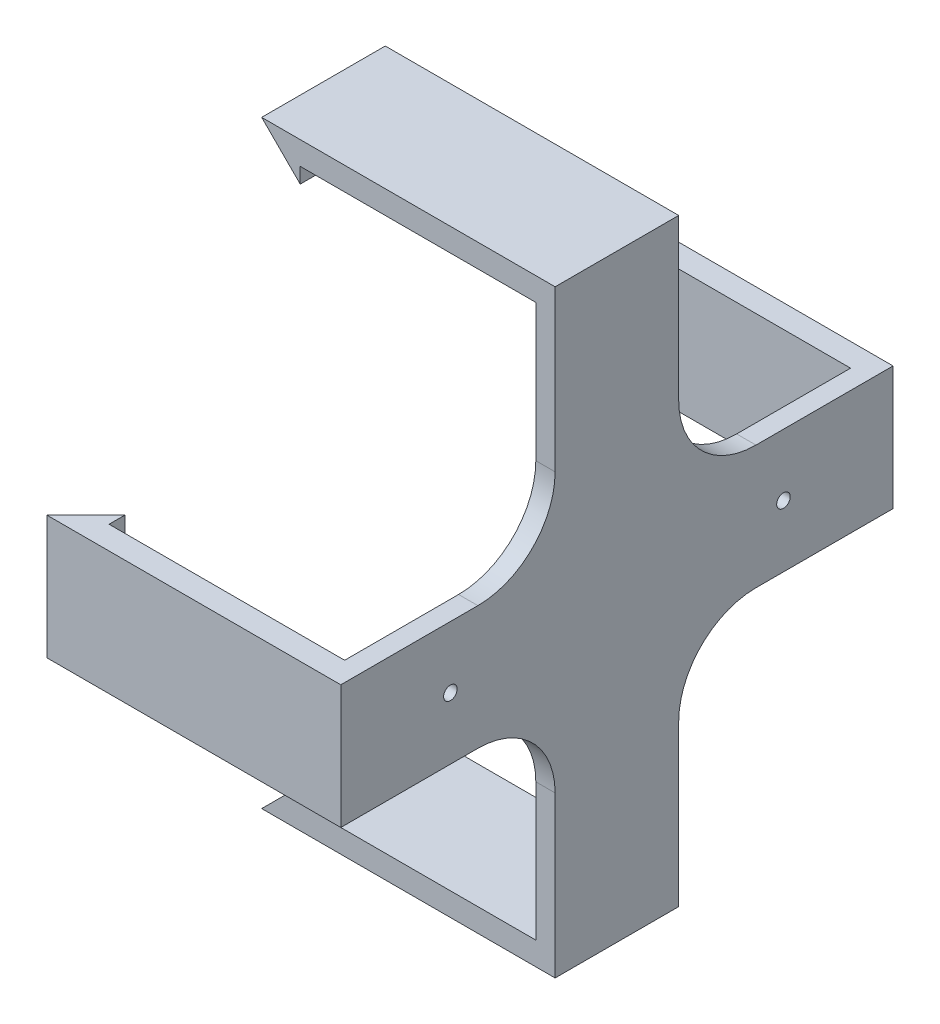
ISO-10303-21;
HEADER;
FILE_DESCRIPTION(('STEP AP214'),'2;1');
FILE_NAME('part.step','',(''),(''),'','','');
FILE_SCHEMA(('AUTOMOTIVE_DESIGN { 1 0 10303 214 1 1 1 1 }'));
ENDSEC;
DATA;
#1=APPLICATION_CONTEXT('core data for automotive mechanical design processes');
#2=APPLICATION_PROTOCOL_DEFINITION('international standard','automotive_design',2000,#1);
#3=PRODUCT_CONTEXT('',#1,'mechanical');
#4=PRODUCT('Part','Part','',(#3));
#5=PRODUCT_RELATED_PRODUCT_CATEGORY('part','',(#4));
#6=PRODUCT_DEFINITION_FORMATION('','',#4);
#7=PRODUCT_DEFINITION_CONTEXT('part definition',#1,'design');
#8=PRODUCT_DEFINITION('design','',#6,#7);
#9=PRODUCT_DEFINITION_SHAPE('','',#8);
#10=(LENGTH_UNIT() NAMED_UNIT(*) SI_UNIT(.MILLI.,.METRE.));
#11=(NAMED_UNIT(*) PLANE_ANGLE_UNIT() SI_UNIT($,.RADIAN.));
#12=(NAMED_UNIT(*) SI_UNIT($,.STERADIAN.) SOLID_ANGLE_UNIT());
#13=UNCERTAINTY_MEASURE_WITH_UNIT(LENGTH_MEASURE(1.E-05),#10,'distance_accuracy_value','');
#14=(GEOMETRIC_REPRESENTATION_CONTEXT(3) GLOBAL_UNCERTAINTY_ASSIGNED_CONTEXT((#13)) GLOBAL_UNIT_ASSIGNED_CONTEXT((#10,
#11,#12)) REPRESENTATION_CONTEXT('',''));
#15=CARTESIAN_POINT('',(0.,0.,0.));
#16=DIRECTION('',(0.,0.,1.));
#17=DIRECTION('',(1.,0.,0.));
#18=AXIS2_PLACEMENT_3D('',#15,#16,#17);
#19=CARTESIAN_POINT('',(6.35,0.,54.7650869624903));
#20=DIRECTION('',(-1.,0.,0.));
#21=DIRECTION('',(0.,0.,1.));
#22=AXIS2_PLACEMENT_3D('',#19,#20,#21);
#23=CYLINDRICAL_SURFACE('',#22,2.2225);
#24=CARTESIAN_POINT('',(6.35,0.,54.7650869624903));
#25=DIRECTION('',(1.,0.,0.));
#26=DIRECTION('',(0.,0.,-1.));
#27=AXIS2_PLACEMENT_3D('',#24,#25,#26);
#28=CIRCLE('',#27,2.2225);
#29=CARTESIAN_POINT('',(6.35,0.,52.5425869624903));
#30=VERTEX_POINT('',#29);
#31=EDGE_CURVE('E386',#30,#30,#28,.F.);
#32=ORIENTED_EDGE('',*,*,#31,.F.);
#33=EDGE_LOOP('',(#32));
#34=FACE_BOUND('',#33,.T.);
#35=CARTESIAN_POINT('',(2.54,0.,54.7650869624903));
#36=DIRECTION('',(-1.,0.,0.));
#37=DIRECTION('',(0.,0.,1.));
#38=AXIS2_PLACEMENT_3D('',#35,#36,#37);
#39=CIRCLE('',#38,2.2225);
#40=CARTESIAN_POINT('',(2.54,0.,56.9875869624903));
#41=VERTEX_POINT('',#40);
#42=EDGE_CURVE('E47',#41,#41,#39,.F.);
#43=ORIENTED_EDGE('',*,*,#42,.F.);
#44=EDGE_LOOP('',(#43));
#45=FACE_BOUND('',#44,.T.);
#46=ADVANCED_FACE('F43',(#34,#45),#23,.F.);
#47=CARTESIAN_POINT('',(0.,0.,0.));
#48=DIRECTION('',(1.,0.,0.));
#49=DIRECTION('',(0.,0.,-1.));
#50=AXIS2_PLACEMENT_3D('',#47,#48,#49);
#51=PLANE('',#50);
#52=CARTESIAN_POINT('',(0.,0.,54.7650869624903));
#53=DIRECTION('',(-1.,0.,0.));
#54=DIRECTION('',(0.,0.,1.));
#55=AXIS2_PLACEMENT_3D('',#52,#53,#54);
#56=CIRCLE('',#55,3.93699999999999);
#57=CARTESIAN_POINT('',(0.,0.,58.7020869624903));
#58=VERTEX_POINT('',#57);
#59=EDGE_CURVE('E457',#58,#58,#56,.T.);
#60=ORIENTED_EDGE('',*,*,#59,.F.);
#61=EDGE_LOOP('',(#60));
#62=FACE_BOUND('',#61,.T.);
#63=CARTESIAN_POINT('',(0.,0.,-54.7650869624903));
#64=DIRECTION('',(-1.,0.,0.));
#65=DIRECTION('',(0.,0.,-1.));
#66=AXIS2_PLACEMENT_3D('',#63,#64,#65);
#67=CIRCLE('',#66,3.93699999999999);
#68=CARTESIAN_POINT('',(0.,0.,-58.7020869624903));
#69=VERTEX_POINT('',#68);
#70=EDGE_CURVE('E462',#69,#69,#67,.T.);
#71=ORIENTED_EDGE('',*,*,#70,.F.);
#72=EDGE_LOOP('',(#71));
#73=FACE_BOUND('',#72,.T.);
#74=DIRECTION('',(0.,0.,-1.));
#75=VECTOR('',#74,1.);
#76=CARTESIAN_POINT('',(0.,-90.805,0.));
#77=LINE('',#76,#75);
#78=CARTESIAN_POINT('',(0.,-90.805,20.32));
#79=VERTEX_POINT('',#78);
#80=CARTESIAN_POINT('',(0.,-90.805,-20.32));
#81=VERTEX_POINT('',#80);
#82=EDGE_CURVE('E309',#79,#81,#77,.T.);
#83=ORIENTED_EDGE('',*,*,#82,.F.);
#84=DIRECTION('',(0.,1.,0.));
#85=VECTOR('',#84,1.);
#86=CARTESIAN_POINT('',(0.,0.,20.32));
#87=LINE('',#86,#85);
#88=CARTESIAN_POINT('',(0.,-45.72,20.32));
#89=VERTEX_POINT('',#88);
#90=EDGE_CURVE('E398',#79,#89,#87,.T.);
#91=ORIENTED_EDGE('',*,*,#90,.T.);
#92=CARTESIAN_POINT('',(0.,-45.72,45.72));
#93=DIRECTION('',(1.,0.,0.));
#94=DIRECTION('',(0.,0.,-1.));
#95=AXIS2_PLACEMENT_3D('',#92,#93,#94);
#96=CIRCLE('',#95,25.4);
#97=CARTESIAN_POINT('',(0.,-20.32,45.72));
#98=VERTEX_POINT('',#97);
#99=EDGE_CURVE('E395',#98,#89,#96,.F.);
#100=ORIENTED_EDGE('',*,*,#99,.F.);
#101=DIRECTION('',(0.,0.,1.));
#102=VECTOR('',#101,1.);
#103=CARTESIAN_POINT('',(0.,-20.32,0.));
#104=LINE('',#103,#102);
#105=CARTESIAN_POINT('',(0.,-20.32,83.185));
#106=VERTEX_POINT('',#105);
#107=EDGE_CURVE('E346',#98,#106,#104,.T.);
#108=ORIENTED_EDGE('',*,*,#107,.T.);
#109=DIRECTION('',(0.,-1.,0.));
#110=VECTOR('',#109,1.);
#111=CARTESIAN_POINT('',(0.,0.,83.185));
#112=LINE('',#111,#110);
#113=CARTESIAN_POINT('',(0.,20.32,83.185));
#114=VERTEX_POINT('',#113);
#115=EDGE_CURVE('E319',#114,#106,#112,.T.);
#116=ORIENTED_EDGE('',*,*,#115,.F.);
#117=DIRECTION('',(0.,0.,1.));
#118=VECTOR('',#117,1.);
#119=CARTESIAN_POINT('',(0.,20.32,0.));
#120=LINE('',#119,#118);
#121=CARTESIAN_POINT('',(0.,20.32,45.72));
#122=VERTEX_POINT('',#121);
#123=EDGE_CURVE('E350',#122,#114,#120,.T.);
#124=ORIENTED_EDGE('',*,*,#123,.F.);
#125=CARTESIAN_POINT('',(0.,45.72,45.72));
#126=DIRECTION('',(1.,0.,0.));
#127=DIRECTION('',(0.,0.,-1.));
#128=AXIS2_PLACEMENT_3D('',#125,#126,#127);
#129=CIRCLE('',#128,25.4);
#130=CARTESIAN_POINT('',(0.,45.72,20.32));
#131=VERTEX_POINT('',#130);
#132=EDGE_CURVE('E418',#122,#131,#129,.T.);
#133=ORIENTED_EDGE('',*,*,#132,.T.);
#134=DIRECTION('',(0.,-1.,0.));
#135=VECTOR('',#134,1.);
#136=CARTESIAN_POINT('',(0.,0.,20.32));
#137=LINE('',#136,#135);
#138=CARTESIAN_POINT('',(0.,90.805,20.32));
#139=VERTEX_POINT('',#138);
#140=EDGE_CURVE('E416',#139,#131,#137,.T.);
#141=ORIENTED_EDGE('',*,*,#140,.F.);
#142=DIRECTION('',(0.,0.,1.));
#143=VECTOR('',#142,1.);
#144=CARTESIAN_POINT('',(0.,90.805,0.));
#145=LINE('',#144,#143);
#146=CARTESIAN_POINT('',(0.,90.805,-20.32));
#147=VERTEX_POINT('',#146);
#148=EDGE_CURVE('E329',#147,#139,#145,.T.);
#149=ORIENTED_EDGE('',*,*,#148,.F.);
#150=DIRECTION('',(0.,-1.,0.));
#151=VECTOR('',#150,1.);
#152=CARTESIAN_POINT('',(0.,0.,-20.32));
#153=LINE('',#152,#151);
#154=CARTESIAN_POINT('',(0.,45.72,-20.32));
#155=VERTEX_POINT('',#154);
#156=EDGE_CURVE('E414',#147,#155,#153,.T.);
#157=ORIENTED_EDGE('',*,*,#156,.T.);
#158=CARTESIAN_POINT('',(0.,45.72,-45.72));
#159=DIRECTION('',(1.,0.,0.));
#160=DIRECTION('',(0.,0.,-1.));
#161=AXIS2_PLACEMENT_3D('',#158,#159,#160);
#162=CIRCLE('',#161,25.4);
#163=CARTESIAN_POINT('',(0.,20.32,-45.72));
#164=VERTEX_POINT('',#163);
#165=EDGE_CURVE('E411',#164,#155,#162,.F.);
#166=ORIENTED_EDGE('',*,*,#165,.F.);
#167=DIRECTION('',(0.,0.,-1.));
#168=VECTOR('',#167,1.);
#169=CARTESIAN_POINT('',(0.,20.32,0.));
#170=LINE('',#169,#168);
#171=CARTESIAN_POINT('',(0.,20.32,-83.185));
#172=VERTEX_POINT('',#171);
#173=EDGE_CURVE('E408',#164,#172,#170,.T.);
#174=ORIENTED_EDGE('',*,*,#173,.T.);
#175=DIRECTION('',(0.,-1.,0.));
#176=VECTOR('',#175,1.);
#177=CARTESIAN_POINT('',(0.,0.,-83.185));
#178=LINE('',#177,#176);
#179=CARTESIAN_POINT('',(0.,-20.32,-83.185));
#180=VERTEX_POINT('',#179);
#181=EDGE_CURVE('E339',#172,#180,#178,.T.);
#182=ORIENTED_EDGE('',*,*,#181,.T.);
#183=DIRECTION('',(0.,0.,-1.));
#184=VECTOR('',#183,1.);
#185=CARTESIAN_POINT('',(0.,-20.32,0.));
#186=LINE('',#185,#184);
#187=CARTESIAN_POINT('',(0.,-20.32,-45.72));
#188=VERTEX_POINT('',#187);
#189=EDGE_CURVE('E405',#188,#180,#186,.T.);
#190=ORIENTED_EDGE('',*,*,#189,.F.);
#191=CARTESIAN_POINT('',(0.,-45.72,-45.72));
#192=DIRECTION('',(1.,0.,0.));
#193=DIRECTION('',(0.,0.,-1.));
#194=AXIS2_PLACEMENT_3D('',#191,#192,#193);
#195=CIRCLE('',#194,25.4);
#196=CARTESIAN_POINT('',(0.,-45.72,-20.32));
#197=VERTEX_POINT('',#196);
#198=EDGE_CURVE('E402',#188,#197,#195,.T.);
#199=ORIENTED_EDGE('',*,*,#198,.T.);
#200=DIRECTION('',(0.,1.,0.));
#201=VECTOR('',#200,1.);
#202=CARTESIAN_POINT('',(0.,0.,-20.32));
#203=LINE('',#202,#201);
#204=EDGE_CURVE('E400',#81,#197,#203,.T.);
#205=ORIENTED_EDGE('',*,*,#204,.F.);
#206=EDGE_LOOP('',(#83,#91,#100,#108,#116,#124,#133,#141,#149,#157,#166,#174,#182,#190,#199,#205));
#207=FACE_BOUND('',#206,.T.);
#208=ADVANCED_FACE('F481',(#62,#73,#207),#51,.F.);
#209=CARTESIAN_POINT('',(6.35,0.,90.805));
#210=DIRECTION('',(0.,0.,-1.));
#211=DIRECTION('',(-1.,0.,0.));
#212=AXIS2_PLACEMENT_3D('',#209,#210,#211);
#213=PLANE('',#212);
#214=DIRECTION('',(-1.,0.,0.));
#215=VECTOR('',#214,1.);
#216=CARTESIAN_POINT('',(6.35,20.32,90.805));
#217=LINE('',#216,#215);
#218=CARTESIAN_POINT('',(6.35,20.32,90.805));
#219=VERTEX_POINT('',#218);
#220=CARTESIAN_POINT('',(-90.2733018975171,20.32,90.805));
#221=VERTEX_POINT('',#220);
#222=EDGE_CURVE('E392',#219,#221,#217,.T.);
#223=ORIENTED_EDGE('',*,*,#222,.T.);
#224=DIRECTION('',(0.,-1.,0.));
#225=VECTOR('',#224,1.);
#226=CARTESIAN_POINT('',(-90.2733018975171,20.32,90.805));
#227=LINE('',#226,#225);
#228=CARTESIAN_POINT('',(-90.2733018975171,-20.32,90.805));
#229=VERTEX_POINT('',#228);
#230=EDGE_CURVE('E279',#221,#229,#227,.T.);
#231=ORIENTED_EDGE('',*,*,#230,.T.);
#232=DIRECTION('',(-1.,0.,0.));
#233=VECTOR('',#232,1.);
#234=CARTESIAN_POINT('',(6.35,-20.32,90.805));
#235=LINE('',#234,#233);
#236=CARTESIAN_POINT('',(6.35,-20.32,90.805));
#237=VERTEX_POINT('',#236);
#238=EDGE_CURVE('E11',#237,#229,#235,.T.);
#239=ORIENTED_EDGE('',*,*,#238,.F.);
#240=DIRECTION('',(0.,-1.,0.));
#241=VECTOR('',#240,1.);
#242=CARTESIAN_POINT('',(6.35,0.,90.805));
#243=LINE('',#242,#241);
#244=EDGE_CURVE('E347',#219,#237,#243,.T.);
#245=ORIENTED_EDGE('',*,*,#244,.F.);
#246=EDGE_LOOP('',(#223,#231,#239,#245));
#247=FACE_BOUND('',#246,.T.);
#248=ADVANCED_FACE('F45',(#247),#213,.F.);
#249=CARTESIAN_POINT('',(6.35,-20.32,0.));
#250=DIRECTION('',(0.,-1.,0.));
#251=DIRECTION('',(0.,0.,-1.));
#252=AXIS2_PLACEMENT_3D('',#249,#250,#251);
#253=PLANE('',#252);
#254=ORIENTED_EDGE('',*,*,#107,.F.);
#255=DIRECTION('',(-1.,0.,0.));
#256=VECTOR('',#255,1.);
#257=CARTESIAN_POINT('',(6.35,-20.32,45.72));
#258=LINE('',#257,#256);
#259=CARTESIAN_POINT('',(6.35,-20.32,45.72));
#260=VERTEX_POINT('',#259);
#261=EDGE_CURVE('E52',#260,#98,#258,.T.);
#262=ORIENTED_EDGE('',*,*,#261,.F.);
#263=DIRECTION('',(0.,0.,1.));
#264=VECTOR('',#263,1.);
#265=CARTESIAN_POINT('',(6.35,-20.32,0.));
#266=LINE('',#265,#264);
#267=EDGE_CURVE('E349',#260,#237,#266,.T.);
#268=ORIENTED_EDGE('',*,*,#267,.T.);
#269=ORIENTED_EDGE('',*,*,#238,.T.);
#270=DIRECTION('',(0.707106781186541,0.,-0.707106781186554));
#271=VECTOR('',#270,1.);
#272=CARTESIAN_POINT('',(-90.2733018975171,-20.32,90.805));
#273=LINE('',#272,#271);
#274=CARTESIAN_POINT('',(-77.4699999999999,-20.32,78.0016981024825));
#275=VERTEX_POINT('',#274);
#276=EDGE_CURVE('E287',#229,#275,#273,.T.);
#277=ORIENTED_EDGE('',*,*,#276,.T.);
#278=DIRECTION('',(0.,0.,1.));
#279=VECTOR('',#278,1.);
#280=CARTESIAN_POINT('',(-77.4699999999999,-20.32,78.0016981024825));
#281=LINE('',#280,#279);
#282=CARTESIAN_POINT('',(-77.4699999999999,-20.32,83.185));
#283=VERTEX_POINT('',#282);
#284=EDGE_CURVE('E284',#275,#283,#281,.T.);
#285=ORIENTED_EDGE('',*,*,#284,.T.);
#286=DIRECTION('',(1.,0.,0.));
#287=VECTOR('',#286,1.);
#288=CARTESIAN_POINT('',(-77.47,-20.32,83.185));
#289=LINE('',#288,#287);
#290=EDGE_CURVE('E323',#283,#106,#289,.T.);
#291=ORIENTED_EDGE('',*,*,#290,.T.);
#292=EDGE_LOOP('',(#254,#262,#268,#269,#277,#285,#291));
#293=FACE_BOUND('',#292,.T.);
#294=ADVANCED_FACE('F503',(#293),#253,.T.);
#295=CARTESIAN_POINT('',(6.35,-45.72,45.72));
#296=DIRECTION('',(-1.,0.,0.));
#297=DIRECTION('',(0.,0.,1.));
#298=AXIS2_PLACEMENT_3D('',#295,#296,#297);
#299=CYLINDRICAL_SURFACE('',#298,25.4);
#300=ORIENTED_EDGE('',*,*,#99,.T.);
#301=DIRECTION('',(-1.,0.,0.));
#302=VECTOR('',#301,1.);
#303=CARTESIAN_POINT('',(6.35,-45.72,20.32));
#304=LINE('',#303,#302);
#305=CARTESIAN_POINT('',(6.35,-45.72,20.32));
#306=VERTEX_POINT('',#305);
#307=EDGE_CURVE('E447',#306,#89,#304,.T.);
#308=ORIENTED_EDGE('',*,*,#307,.F.);
#309=CARTESIAN_POINT('',(6.35,-45.72,45.72));
#310=DIRECTION('',(1.,0.,0.));
#311=DIRECTION('',(0.,0.,-1.));
#312=AXIS2_PLACEMENT_3D('',#309,#310,#311);
#313=CIRCLE('',#312,25.4);
#314=EDGE_CURVE('E353',#260,#306,#313,.F.);
#315=ORIENTED_EDGE('',*,*,#314,.F.);
#316=ORIENTED_EDGE('',*,*,#261,.T.);
#317=EDGE_LOOP('',(#300,#308,#315,#316));
#318=FACE_BOUND('',#317,.T.);
#319=ADVANCED_FACE('F499',(#318),#299,.F.);
#320=CARTESIAN_POINT('',(6.35,0.,20.32));
#321=DIRECTION('',(0.,0.,1.));
#322=DIRECTION('',(0.,-1.,0.));
#323=AXIS2_PLACEMENT_3D('',#320,#321,#322);
#324=PLANE('',#323);
#325=ORIENTED_EDGE('',*,*,#90,.F.);
#326=DIRECTION('',(1.,0.,0.));
#327=VECTOR('',#326,1.);
#328=CARTESIAN_POINT('',(-77.47,-90.805,20.32));
#329=LINE('',#328,#327);
#330=CARTESIAN_POINT('',(-77.47,-90.805,20.32));
#331=VERTEX_POINT('',#330);
#332=EDGE_CURVE('E317',#331,#79,#329,.T.);
#333=ORIENTED_EDGE('',*,*,#332,.F.);
#334=DIRECTION('',(0.,-1.,0.));
#335=VECTOR('',#334,1.);
#336=CARTESIAN_POINT('',(-77.47,-85.7466948068078,20.32));
#337=LINE('',#336,#335);
#338=CARTESIAN_POINT('',(-77.47,-85.7466948068078,20.32));
#339=VERTEX_POINT('',#338);
#340=EDGE_CURVE('E261',#339,#331,#337,.T.);
#341=ORIENTED_EDGE('',*,*,#340,.F.);
#342=DIRECTION('',(0.707106781186551,0.707106781186544,0.));
#343=VECTOR('',#342,1.);
#344=CARTESIAN_POINT('',(-90.1483051931923,-98.425,20.32));
#345=LINE('',#344,#343);
#346=CARTESIAN_POINT('',(-90.1483051931923,-98.425,20.32));
#347=VERTEX_POINT('',#346);
#348=EDGE_CURVE('E258',#347,#339,#345,.T.);
#349=ORIENTED_EDGE('',*,*,#348,.F.);
#350=DIRECTION('',(-1.,0.,0.));
#351=VECTOR('',#350,1.);
#352=CARTESIAN_POINT('',(6.35,-98.425,20.32));
#353=LINE('',#352,#351);
#354=CARTESIAN_POINT('',(6.35,-98.425,20.32));
#355=VERTEX_POINT('',#354);
#356=EDGE_CURVE('E240',#355,#347,#353,.T.);
#357=ORIENTED_EDGE('',*,*,#356,.F.);
#358=DIRECTION('',(0.,1.,0.));
#359=VECTOR('',#358,1.);
#360=CARTESIAN_POINT('',(6.35,0.,20.32));
#361=LINE('',#360,#359);
#362=EDGE_CURVE('E355',#355,#306,#361,.T.);
#363=ORIENTED_EDGE('',*,*,#362,.T.);
#364=ORIENTED_EDGE('',*,*,#307,.T.);
#365=EDGE_LOOP('',(#325,#333,#341,#349,#357,#363,#364));
#366=FACE_BOUND('',#365,.T.);
#367=ADVANCED_FACE('F493',(#366),#324,.T.);
#368=CARTESIAN_POINT('',(6.35,-98.425,0.));
#369=DIRECTION('',(0.,-1.,0.));
#370=DIRECTION('',(0.,0.,-1.));
#371=AXIS2_PLACEMENT_3D('',#368,#369,#370);
#372=PLANE('',#371);
#373=ORIENTED_EDGE('',*,*,#356,.T.);
#374=DIRECTION('',(0.,0.,-1.));
#375=VECTOR('',#374,1.);
#376=CARTESIAN_POINT('',(-90.1483051931923,-98.425,20.32));
#377=LINE('',#376,#375);
#378=CARTESIAN_POINT('',(-90.1483051931923,-98.425,-20.32));
#379=VERTEX_POINT('',#378);
#380=EDGE_CURVE('E244',#347,#379,#377,.T.);
#381=ORIENTED_EDGE('',*,*,#380,.T.);
#382=DIRECTION('',(-1.,0.,0.));
#383=VECTOR('',#382,1.);
#384=CARTESIAN_POINT('',(6.35,-98.425,-20.32));
#385=LINE('',#384,#383);
#386=CARTESIAN_POINT('',(6.35,-98.425,-20.32));
#387=VERTEX_POINT('',#386);
#388=EDGE_CURVE('E230',#387,#379,#385,.T.);
#389=ORIENTED_EDGE('',*,*,#388,.F.);
#390=DIRECTION('',(0.,0.,1.));
#391=VECTOR('',#390,1.);
#392=CARTESIAN_POINT('',(6.35,-98.425,0.));
#393=LINE('',#392,#391);
#394=EDGE_CURVE('E358',#387,#355,#393,.T.);
#395=ORIENTED_EDGE('',*,*,#394,.T.);
#396=EDGE_LOOP('',(#373,#381,#389,#395));
#397=FACE_BOUND('',#396,.T.);
#398=ADVANCED_FACE('F245',(#397),#372,.T.);
#399=CARTESIAN_POINT('',(6.35,0.,-20.32));
#400=DIRECTION('',(0.,0.,1.));
#401=DIRECTION('',(0.,-1.,0.));
#402=AXIS2_PLACEMENT_3D('',#399,#400,#401);
#403=PLANE('',#402);
#404=ORIENTED_EDGE('',*,*,#388,.T.);
#405=DIRECTION('',(0.707106781186551,0.707106781186544,0.));
#406=VECTOR('',#405,1.);
#407=CARTESIAN_POINT('',(-90.1483051931923,-98.425,-20.32));
#408=LINE('',#407,#406);
#409=CARTESIAN_POINT('',(-77.47,-85.7466948068078,-20.32));
#410=VERTEX_POINT('',#409);
#411=EDGE_CURVE('E234',#379,#410,#408,.T.);
#412=ORIENTED_EDGE('',*,*,#411,.T.);
#413=DIRECTION('',(0.,-1.,0.));
#414=VECTOR('',#413,1.);
#415=CARTESIAN_POINT('',(-77.47,-85.7466948068078,-20.32));
#416=LINE('',#415,#414);
#417=CARTESIAN_POINT('',(-77.47,-90.805,-20.32));
#418=VERTEX_POINT('',#417);
#419=EDGE_CURVE('E254',#410,#418,#416,.T.);
#420=ORIENTED_EDGE('',*,*,#419,.T.);
#421=DIRECTION('',(1.,0.,0.));
#422=VECTOR('',#421,1.);
#423=CARTESIAN_POINT('',(-77.47,-90.805,-20.32));
#424=LINE('',#423,#422);
#425=EDGE_CURVE('E60',#418,#81,#424,.T.);
#426=ORIENTED_EDGE('',*,*,#425,.T.);
#427=ORIENTED_EDGE('',*,*,#204,.T.);
#428=DIRECTION('',(-1.,0.,0.));
#429=VECTOR('',#428,1.);
#430=CARTESIAN_POINT('',(6.35,-45.72,-20.32));
#431=LINE('',#430,#429);
#432=CARTESIAN_POINT('',(6.35,-45.72,-20.32));
#433=VERTEX_POINT('',#432);
#434=EDGE_CURVE('E241',#433,#197,#431,.T.);
#435=ORIENTED_EDGE('',*,*,#434,.F.);
#436=DIRECTION('',(0.,1.,0.));
#437=VECTOR('',#436,1.);
#438=CARTESIAN_POINT('',(6.35,0.,-20.32));
#439=LINE('',#438,#437);
#440=EDGE_CURVE('E236',#387,#433,#439,.T.);
#441=ORIENTED_EDGE('',*,*,#440,.F.);
#442=EDGE_LOOP('',(#404,#412,#420,#426,#427,#435,#441));
#443=FACE_BOUND('',#442,.T.);
#444=ADVANCED_FACE('F232',(#443),#403,.F.);
#445=CARTESIAN_POINT('',(6.35,-45.72,-45.72));
#446=DIRECTION('',(-1.,0.,0.));
#447=DIRECTION('',(0.,0.,1.));
#448=AXIS2_PLACEMENT_3D('',#445,#446,#447);
#449=CYLINDRICAL_SURFACE('',#448,25.4);
#450=ORIENTED_EDGE('',*,*,#198,.F.);
#451=DIRECTION('',(-1.,0.,0.));
#452=VECTOR('',#451,1.);
#453=CARTESIAN_POINT('',(6.35,-20.32,-45.72));
#454=LINE('',#453,#452);
#455=CARTESIAN_POINT('',(6.35,-20.32,-45.72));
#456=VERTEX_POINT('',#455);
#457=EDGE_CURVE('E442',#456,#188,#454,.T.);
#458=ORIENTED_EDGE('',*,*,#457,.F.);
#459=CARTESIAN_POINT('',(6.35,-45.72,-45.72));
#460=DIRECTION('',(1.,0.,0.));
#461=DIRECTION('',(0.,0.,-1.));
#462=AXIS2_PLACEMENT_3D('',#459,#460,#461);
#463=CIRCLE('',#462,25.4);
#464=EDGE_CURVE('E361',#456,#433,#463,.T.);
#465=ORIENTED_EDGE('',*,*,#464,.T.);
#466=ORIENTED_EDGE('',*,*,#434,.T.);
#467=EDGE_LOOP('',(#450,#458,#465,#466));
#468=FACE_BOUND('',#467,.T.);
#469=ADVANCED_FACE('F554',(#468),#449,.F.);
#470=CARTESIAN_POINT('',(6.35,-20.32,0.));
#471=DIRECTION('',(0.,1.,0.));
#472=DIRECTION('',(0.,0.,1.));
#473=AXIS2_PLACEMENT_3D('',#470,#471,#472);
#474=PLANE('',#473);
#475=ORIENTED_EDGE('',*,*,#189,.T.);
#476=DIRECTION('',(1.,0.,0.));
#477=VECTOR('',#476,1.);
#478=CARTESIAN_POINT('',(-77.47,-20.32,-83.185));
#479=LINE('',#478,#477);
#480=CARTESIAN_POINT('',(-77.47,-20.32,-83.185));
#481=VERTEX_POINT('',#480);
#482=EDGE_CURVE('E68',#481,#180,#479,.T.);
#483=ORIENTED_EDGE('',*,*,#482,.F.);
#484=DIRECTION('',(0.,0.,1.));
#485=VECTOR('',#484,1.);
#486=CARTESIAN_POINT('',(-77.47,-20.32,-78.0016981024825));
#487=LINE('',#486,#485);
#488=CARTESIAN_POINT('',(-77.47,-20.32,-78.0016981024825));
#489=VERTEX_POINT('',#488);
#490=EDGE_CURVE('E291',#481,#489,#487,.T.);
#491=ORIENTED_EDGE('',*,*,#490,.T.);
#492=DIRECTION('',(-0.707106781186541,0.,-0.707106781186554));
#493=VECTOR('',#492,1.);
#494=CARTESIAN_POINT('',(-90.2733018975173,-20.32,-90.805));
#495=LINE('',#494,#493);
#496=CARTESIAN_POINT('',(-90.2733018975173,-20.32,-90.805));
#497=VERTEX_POINT('',#496);
#498=EDGE_CURVE('E299',#489,#497,#495,.T.);
#499=ORIENTED_EDGE('',*,*,#498,.T.);
#500=DIRECTION('',(-1.,0.,0.));
#501=VECTOR('',#500,1.);
#502=CARTESIAN_POINT('',(6.35,-20.32,-90.805));
#503=LINE('',#502,#501);
#504=CARTESIAN_POINT('',(6.35,-20.32,-90.805));
#505=VERTEX_POINT('',#504);
#506=EDGE_CURVE('E440',#505,#497,#503,.T.);
#507=ORIENTED_EDGE('',*,*,#506,.F.);
#508=DIRECTION('',(0.,0.,-1.));
#509=VECTOR('',#508,1.);
#510=CARTESIAN_POINT('',(6.35,-20.32,0.));
#511=LINE('',#510,#509);
#512=EDGE_CURVE('E364',#456,#505,#511,.T.);
#513=ORIENTED_EDGE('',*,*,#512,.F.);
#514=ORIENTED_EDGE('',*,*,#457,.T.);
#515=EDGE_LOOP('',(#475,#483,#491,#499,#507,#513,#514));
#516=FACE_BOUND('',#515,.T.);
#517=ADVANCED_FACE('F549',(#516),#474,.F.);
#518=CARTESIAN_POINT('',(6.35,0.,-90.805));
#519=DIRECTION('',(0.,0.,-1.));
#520=DIRECTION('',(-1.,0.,0.));
#521=AXIS2_PLACEMENT_3D('',#518,#519,#520);
#522=PLANE('',#521);
#523=ORIENTED_EDGE('',*,*,#506,.T.);
#524=DIRECTION('',(0.,-1.,0.));
#525=VECTOR('',#524,1.);
#526=CARTESIAN_POINT('',(-90.2733018975173,20.32,-90.805));
#527=LINE('',#526,#525);
#528=CARTESIAN_POINT('',(-90.2733018975173,20.32,-90.805));
#529=VERTEX_POINT('',#528);
#530=EDGE_CURVE('E306',#529,#497,#527,.T.);
#531=ORIENTED_EDGE('',*,*,#530,.F.);
#532=DIRECTION('',(-1.,0.,0.));
#533=VECTOR('',#532,1.);
#534=CARTESIAN_POINT('',(6.35,20.32,-90.805));
#535=LINE('',#534,#533);
#536=CARTESIAN_POINT('',(6.35,20.32,-90.805));
#537=VERTEX_POINT('',#536);
#538=EDGE_CURVE('E438',#537,#529,#535,.T.);
#539=ORIENTED_EDGE('',*,*,#538,.F.);
#540=DIRECTION('',(0.,-1.,0.));
#541=VECTOR('',#540,1.);
#542=CARTESIAN_POINT('',(6.35,0.,-90.805));
#543=LINE('',#542,#541);
#544=EDGE_CURVE('E366',#537,#505,#543,.T.);
#545=ORIENTED_EDGE('',*,*,#544,.T.);
#546=EDGE_LOOP('',(#523,#531,#539,#545));
#547=FACE_BOUND('',#546,.T.);
#548=ADVANCED_FACE('F606',(#547),#522,.T.);
#549=CARTESIAN_POINT('',(6.35,20.32,0.));
#550=DIRECTION('',(0.,1.,0.));
#551=DIRECTION('',(0.,0.,1.));
#552=AXIS2_PLACEMENT_3D('',#549,#550,#551);
#553=PLANE('',#552);
#554=ORIENTED_EDGE('',*,*,#173,.F.);
#555=DIRECTION('',(-1.,0.,0.));
#556=VECTOR('',#555,1.);
#557=CARTESIAN_POINT('',(6.35,20.32,-45.72));
#558=LINE('',#557,#556);
#559=CARTESIAN_POINT('',(6.35,20.32,-45.72));
#560=VERTEX_POINT('',#559);
#561=EDGE_CURVE('E436',#560,#164,#558,.T.);
#562=ORIENTED_EDGE('',*,*,#561,.F.);
#563=DIRECTION('',(0.,0.,-1.));
#564=VECTOR('',#563,1.);
#565=CARTESIAN_POINT('',(6.35,20.32,0.));
#566=LINE('',#565,#564);
#567=EDGE_CURVE('E369',#560,#537,#566,.T.);
#568=ORIENTED_EDGE('',*,*,#567,.T.);
#569=ORIENTED_EDGE('',*,*,#538,.T.);
#570=DIRECTION('',(-0.707106781186541,0.,-0.707106781186554));
#571=VECTOR('',#570,1.);
#572=CARTESIAN_POINT('',(-90.2733018975173,20.32,-90.805));
#573=LINE('',#572,#571);
#574=CARTESIAN_POINT('',(-77.47,20.32,-78.0016981024825));
#575=VERTEX_POINT('',#574);
#576=EDGE_CURVE('E298',#575,#529,#573,.T.);
#577=ORIENTED_EDGE('',*,*,#576,.F.);
#578=DIRECTION('',(0.,0.,1.));
#579=VECTOR('',#578,1.);
#580=CARTESIAN_POINT('',(-77.47,20.32,-78.0016981024825));
#581=LINE('',#580,#579);
#582=CARTESIAN_POINT('',(-77.47,20.32,-83.185));
#583=VERTEX_POINT('',#582);
#584=EDGE_CURVE('E296',#583,#575,#581,.T.);
#585=ORIENTED_EDGE('',*,*,#584,.F.);
#586=DIRECTION('',(1.,0.,0.));
#587=VECTOR('',#586,1.);
#588=CARTESIAN_POINT('',(-77.47,20.32,-83.185));
#589=LINE('',#588,#587);
#590=EDGE_CURVE('E344',#583,#172,#589,.T.);
#591=ORIENTED_EDGE('',*,*,#590,.T.);
#592=EDGE_LOOP('',(#554,#562,#568,#569,#577,#585,#591));
#593=FACE_BOUND('',#592,.T.);
#594=ADVANCED_FACE('F541',(#593),#553,.T.);
#595=CARTESIAN_POINT('',(6.35,45.72,-45.72));
#596=DIRECTION('',(-1.,0.,0.));
#597=DIRECTION('',(0.,0.,1.));
#598=AXIS2_PLACEMENT_3D('',#595,#596,#597);
#599=CYLINDRICAL_SURFACE('',#598,25.4);
#600=ORIENTED_EDGE('',*,*,#165,.T.);
#601=DIRECTION('',(-1.,0.,0.));
#602=VECTOR('',#601,1.);
#603=CARTESIAN_POINT('',(6.35,45.72,-20.32));
#604=LINE('',#603,#602);
#605=CARTESIAN_POINT('',(6.35,45.72,-20.32));
#606=VERTEX_POINT('',#605);
#607=EDGE_CURVE('E433',#606,#155,#604,.T.);
#608=ORIENTED_EDGE('',*,*,#607,.F.);
#609=CARTESIAN_POINT('',(6.35,45.72,-45.72));
#610=DIRECTION('',(1.,0.,0.));
#611=DIRECTION('',(0.,0.,-1.));
#612=AXIS2_PLACEMENT_3D('',#609,#610,#611);
#613=CIRCLE('',#612,25.4);
#614=EDGE_CURVE('E372',#560,#606,#613,.F.);
#615=ORIENTED_EDGE('',*,*,#614,.F.);
#616=ORIENTED_EDGE('',*,*,#561,.T.);
#617=EDGE_LOOP('',(#600,#608,#615,#616));
#618=FACE_BOUND('',#617,.T.);
#619=ADVANCED_FACE('F538',(#618),#599,.F.);
#620=CARTESIAN_POINT('',(6.35,0.,-20.32));
#621=DIRECTION('',(0.,0.,-1.));
#622=DIRECTION('',(0.,1.,0.));
#623=AXIS2_PLACEMENT_3D('',#620,#621,#622);
#624=PLANE('',#623);
#625=ORIENTED_EDGE('',*,*,#156,.F.);
#626=DIRECTION('',(1.,0.,0.));
#627=VECTOR('',#626,1.);
#628=CARTESIAN_POINT('',(-77.47,90.805,-20.32));
#629=LINE('',#628,#627);
#630=CARTESIAN_POINT('',(-77.47,90.805,-20.32));
#631=VERTEX_POINT('',#630);
#632=EDGE_CURVE('E337',#631,#147,#629,.T.);
#633=ORIENTED_EDGE('',*,*,#632,.F.);
#634=DIRECTION('',(0.,1.,0.));
#635=VECTOR('',#634,1.);
#636=CARTESIAN_POINT('',(-77.47,85.7466948068078,-20.32));
#637=LINE('',#636,#635);
#638=CARTESIAN_POINT('',(-77.47,85.7466948068078,-20.32));
#639=VERTEX_POINT('',#638);
#640=EDGE_CURVE('E256',#639,#631,#637,.T.);
#641=ORIENTED_EDGE('',*,*,#640,.F.);
#642=DIRECTION('',(0.707106781186551,-0.707106781186544,0.));
#643=VECTOR('',#642,1.);
#644=CARTESIAN_POINT('',(-90.1483051931923,98.425,-20.32));
#645=LINE('',#644,#643);
#646=CARTESIAN_POINT('',(-90.1483051931923,98.425,-20.32));
#647=VERTEX_POINT('',#646);
#648=EDGE_CURVE('E253',#647,#639,#645,.T.);
#649=ORIENTED_EDGE('',*,*,#648,.F.);
#650=DIRECTION('',(-1.,0.,0.));
#651=VECTOR('',#650,1.);
#652=CARTESIAN_POINT('',(6.35,98.425,-20.32));
#653=LINE('',#652,#651);
#654=CARTESIAN_POINT('',(6.35,98.425,-20.32));
#655=VERTEX_POINT('',#654);
#656=EDGE_CURVE('E431',#655,#647,#653,.T.);
#657=ORIENTED_EDGE('',*,*,#656,.F.);
#658=DIRECTION('',(0.,-1.,0.));
#659=VECTOR('',#658,1.);
#660=CARTESIAN_POINT('',(6.35,0.,-20.32));
#661=LINE('',#660,#659);
#662=EDGE_CURVE('E374',#655,#606,#661,.T.);
#663=ORIENTED_EDGE('',*,*,#662,.T.);
#664=ORIENTED_EDGE('',*,*,#607,.T.);
#665=EDGE_LOOP('',(#625,#633,#641,#649,#657,#663,#664));
#666=FACE_BOUND('',#665,.T.);
#667=ADVANCED_FACE('F532',(#666),#624,.T.);
#668=CARTESIAN_POINT('',(6.35,98.425,0.));
#669=DIRECTION('',(0.,-1.,0.));
#670=DIRECTION('',(0.,0.,-1.));
#671=AXIS2_PLACEMENT_3D('',#668,#669,#670);
#672=PLANE('',#671);
#673=ORIENTED_EDGE('',*,*,#656,.T.);
#674=DIRECTION('',(0.,0.,-1.));
#675=VECTOR('',#674,1.);
#676=CARTESIAN_POINT('',(-90.1483051931923,98.425,20.32));
#677=LINE('',#676,#675);
#678=CARTESIAN_POINT('',(-90.1483051931923,98.425,20.32));
#679=VERTEX_POINT('',#678);
#680=EDGE_CURVE('E275',#679,#647,#677,.T.);
#681=ORIENTED_EDGE('',*,*,#680,.F.);
#682=DIRECTION('',(-1.,0.,0.));
#683=VECTOR('',#682,1.);
#684=CARTESIAN_POINT('',(6.35,98.425,20.32));
#685=LINE('',#684,#683);
#686=CARTESIAN_POINT('',(6.35,98.425,20.32));
#687=VERTEX_POINT('',#686);
#688=EDGE_CURVE('E429',#687,#679,#685,.T.);
#689=ORIENTED_EDGE('',*,*,#688,.F.);
#690=DIRECTION('',(0.,0.,1.));
#691=VECTOR('',#690,1.);
#692=CARTESIAN_POINT('',(6.35,98.425,0.));
#693=LINE('',#692,#691);
#694=EDGE_CURVE('E377',#655,#687,#693,.T.);
#695=ORIENTED_EDGE('',*,*,#694,.F.);
#696=EDGE_LOOP('',(#673,#681,#689,#695));
#697=FACE_BOUND('',#696,.T.);
#698=ADVANCED_FACE('F596',(#697),#672,.F.);
#699=CARTESIAN_POINT('',(6.35,0.,20.32));
#700=DIRECTION('',(0.,0.,-1.));
#701=DIRECTION('',(0.,1.,0.));
#702=AXIS2_PLACEMENT_3D('',#699,#700,#701);
#703=PLANE('',#702);
#704=ORIENTED_EDGE('',*,*,#688,.T.);
#705=DIRECTION('',(0.707106781186551,-0.707106781186544,0.));
#706=VECTOR('',#705,1.);
#707=CARTESIAN_POINT('',(-90.1483051931923,98.425,20.32));
#708=LINE('',#707,#706);
#709=CARTESIAN_POINT('',(-77.47,85.7466948068078,20.32));
#710=VERTEX_POINT('',#709);
#711=EDGE_CURVE('E265',#679,#710,#708,.T.);
#712=ORIENTED_EDGE('',*,*,#711,.T.);
#713=DIRECTION('',(0.,1.,0.));
#714=VECTOR('',#713,1.);
#715=CARTESIAN_POINT('',(-77.47,85.7466948068078,20.32));
#716=LINE('',#715,#714);
#717=CARTESIAN_POINT('',(-77.47,90.805,20.32));
#718=VERTEX_POINT('',#717);
#719=EDGE_CURVE('E267',#710,#718,#716,.T.);
#720=ORIENTED_EDGE('',*,*,#719,.T.);
#721=DIRECTION('',(1.,0.,0.));
#722=VECTOR('',#721,1.);
#723=CARTESIAN_POINT('',(-77.47,90.805,20.32));
#724=LINE('',#723,#722);
#725=EDGE_CURVE('E333',#718,#139,#724,.T.);
#726=ORIENTED_EDGE('',*,*,#725,.T.);
#727=ORIENTED_EDGE('',*,*,#140,.T.);
#728=DIRECTION('',(-1.,0.,0.));
#729=VECTOR('',#728,1.);
#730=CARTESIAN_POINT('',(6.35,45.72,20.32));
#731=LINE('',#730,#729);
#732=CARTESIAN_POINT('',(6.35,45.72,20.32));
#733=VERTEX_POINT('',#732);
#734=EDGE_CURVE('E426',#733,#131,#731,.T.);
#735=ORIENTED_EDGE('',*,*,#734,.F.);
#736=DIRECTION('',(0.,-1.,0.));
#737=VECTOR('',#736,1.);
#738=CARTESIAN_POINT('',(6.35,0.,20.32));
#739=LINE('',#738,#737);
#740=EDGE_CURVE('E379',#687,#733,#739,.T.);
#741=ORIENTED_EDGE('',*,*,#740,.F.);
#742=EDGE_LOOP('',(#704,#712,#720,#726,#727,#735,#741));
#743=FACE_BOUND('',#742,.T.);
#744=ADVANCED_FACE('F525',(#743),#703,.F.);
#745=CARTESIAN_POINT('',(6.35,45.72,45.72));
#746=DIRECTION('',(-1.,0.,0.));
#747=DIRECTION('',(0.,0.,1.));
#748=AXIS2_PLACEMENT_3D('',#745,#746,#747);
#749=CYLINDRICAL_SURFACE('',#748,25.4);
#750=ORIENTED_EDGE('',*,*,#132,.F.);
#751=DIRECTION('',(-1.,0.,0.));
#752=VECTOR('',#751,1.);
#753=CARTESIAN_POINT('',(6.35,20.32,45.72));
#754=LINE('',#753,#752);
#755=CARTESIAN_POINT('',(6.35,20.32,45.72));
#756=VERTEX_POINT('',#755);
#757=EDGE_CURVE('E424',#756,#122,#754,.T.);
#758=ORIENTED_EDGE('',*,*,#757,.F.);
#759=CARTESIAN_POINT('',(6.35,45.72,45.72));
#760=DIRECTION('',(1.,0.,0.));
#761=DIRECTION('',(0.,0.,-1.));
#762=AXIS2_PLACEMENT_3D('',#759,#760,#761);
#763=CIRCLE('',#762,25.4);
#764=EDGE_CURVE('E381',#756,#733,#763,.T.);
#765=ORIENTED_EDGE('',*,*,#764,.T.);
#766=ORIENTED_EDGE('',*,*,#734,.T.);
#767=EDGE_LOOP('',(#750,#758,#765,#766));
#768=FACE_BOUND('',#767,.T.);
#769=ADVANCED_FACE('F519',(#768),#749,.F.);
#770=CARTESIAN_POINT('',(6.35,20.32,0.));
#771=DIRECTION('',(0.,-1.,0.));
#772=DIRECTION('',(0.,0.,-1.));
#773=AXIS2_PLACEMENT_3D('',#770,#771,#772);
#774=PLANE('',#773);
#775=ORIENTED_EDGE('',*,*,#123,.T.);
#776=DIRECTION('',(1.,0.,0.));
#777=VECTOR('',#776,1.);
#778=CARTESIAN_POINT('',(-77.47,20.32,83.185));
#779=LINE('',#778,#777);
#780=CARTESIAN_POINT('',(-77.47,20.32,83.185));
#781=VERTEX_POINT('',#780);
#782=EDGE_CURVE('E327',#781,#114,#779,.T.);
#783=ORIENTED_EDGE('',*,*,#782,.F.);
#784=DIRECTION('',(0.,0.,1.));
#785=VECTOR('',#784,1.);
#786=CARTESIAN_POINT('',(-77.4699999999999,20.32,78.0016981024825));
#787=LINE('',#786,#785);
#788=CARTESIAN_POINT('',(-77.4699999999999,20.32,78.0016981024825));
#789=VERTEX_POINT('',#788);
#790=EDGE_CURVE('E282',#789,#781,#787,.T.);
#791=ORIENTED_EDGE('',*,*,#790,.F.);
#792=DIRECTION('',(0.707106781186541,0.,-0.707106781186554));
#793=VECTOR('',#792,1.);
#794=CARTESIAN_POINT('',(-90.2733018975171,20.32,90.805));
#795=LINE('',#794,#793);
#796=EDGE_CURVE('E288',#221,#789,#795,.T.);
#797=ORIENTED_EDGE('',*,*,#796,.F.);
#798=ORIENTED_EDGE('',*,*,#222,.F.);
#799=DIRECTION('',(0.,0.,1.));
#800=VECTOR('',#799,1.);
#801=CARTESIAN_POINT('',(6.35,20.32,0.));
#802=LINE('',#801,#800);
#803=EDGE_CURVE('E384',#756,#219,#802,.T.);
#804=ORIENTED_EDGE('',*,*,#803,.F.);
#805=ORIENTED_EDGE('',*,*,#757,.T.);
#806=EDGE_LOOP('',(#775,#783,#791,#797,#798,#804,#805));
#807=FACE_BOUND('',#806,.T.);
#808=ADVANCED_FACE('F513',(#807),#774,.F.);
#809=CARTESIAN_POINT('',(6.35,0.,-54.7650869624903));
#810=DIRECTION('',(-1.,0.,0.));
#811=DIRECTION('',(0.,0.,1.));
#812=AXIS2_PLACEMENT_3D('',#809,#810,#811);
#813=CYLINDRICAL_SURFACE('',#812,2.2225);
#814=CARTESIAN_POINT('',(2.54,0.,-54.7650869624903));
#815=DIRECTION('',(1.,0.,0.));
#816=DIRECTION('',(0.,0.,-1.));
#817=AXIS2_PLACEMENT_3D('',#814,#815,#816);
#818=CIRCLE('',#817,2.2225);
#819=CARTESIAN_POINT('',(2.54,0.,-56.9875869624903));
#820=VERTEX_POINT('',#819);
#821=EDGE_CURVE('E450',#820,#820,#818,.T.);
#822=ORIENTED_EDGE('',*,*,#821,.F.);
#823=EDGE_LOOP('',(#822));
#824=FACE_BOUND('',#823,.T.);
#825=CARTESIAN_POINT('',(6.35,0.,-54.7650869624903));
#826=DIRECTION('',(1.,0.,0.));
#827=DIRECTION('',(0.,0.,-1.));
#828=AXIS2_PLACEMENT_3D('',#825,#826,#827);
#829=CIRCLE('',#828,2.2225);
#830=CARTESIAN_POINT('',(6.35,0.,-56.9875869624903));
#831=VERTEX_POINT('',#830);
#832=EDGE_CURVE('E389',#831,#831,#829,.T.);
#833=ORIENTED_EDGE('',*,*,#832,.T.);
#834=EDGE_LOOP('',(#833));
#835=FACE_BOUND('',#834,.T.);
#836=ADVANCED_FACE('F589',(#824,#835),#813,.F.);
#837=CARTESIAN_POINT('',(6.35,0.,0.));
#838=DIRECTION('',(1.,0.,0.));
#839=DIRECTION('',(0.,0.,-1.));
#840=AXIS2_PLACEMENT_3D('',#837,#838,#839);
#841=PLANE('',#840);
#842=ORIENTED_EDGE('',*,*,#244,.T.);
#843=ORIENTED_EDGE('',*,*,#267,.F.);
#844=ORIENTED_EDGE('',*,*,#314,.T.);
#845=ORIENTED_EDGE('',*,*,#362,.F.);
#846=ORIENTED_EDGE('',*,*,#394,.F.);
#847=ORIENTED_EDGE('',*,*,#440,.T.);
#848=ORIENTED_EDGE('',*,*,#464,.F.);
#849=ORIENTED_EDGE('',*,*,#512,.T.);
#850=ORIENTED_EDGE('',*,*,#544,.F.);
#851=ORIENTED_EDGE('',*,*,#567,.F.);
#852=ORIENTED_EDGE('',*,*,#614,.T.);
#853=ORIENTED_EDGE('',*,*,#662,.F.);
#854=ORIENTED_EDGE('',*,*,#694,.T.);
#855=ORIENTED_EDGE('',*,*,#740,.T.);
#856=ORIENTED_EDGE('',*,*,#764,.F.);
#857=ORIENTED_EDGE('',*,*,#803,.T.);
#858=EDGE_LOOP('',(#842,#843,#844,#845,#846,#847,#848,#849,#850,#851,#852,#853,#854,#855,#856,#857));
#859=FACE_BOUND('',#858,.T.);
#860=ORIENTED_EDGE('',*,*,#31,.T.);
#861=EDGE_LOOP('',(#860));
#862=FACE_BOUND('',#861,.T.);
#863=ORIENTED_EDGE('',*,*,#832,.F.);
#864=EDGE_LOOP('',(#863));
#865=FACE_BOUND('',#864,.T.);
#866=ADVANCED_FACE('F556',(#859,#862,#865),#841,.T.);
#867=CARTESIAN_POINT('',(-77.47,0.,-83.185));
#868=DIRECTION('',(0.,0.,1.));
#869=DIRECTION('',(1.,0.,0.));
#870=AXIS2_PLACEMENT_3D('',#867,#868,#869);
#871=PLANE('',#870);
#872=ORIENTED_EDGE('',*,*,#181,.F.);
#873=ORIENTED_EDGE('',*,*,#590,.F.);
#874=DIRECTION('',(0.,-1.,0.));
#875=VECTOR('',#874,1.);
#876=CARTESIAN_POINT('',(-77.47,0.,-83.185));
#877=LINE('',#876,#875);
#878=EDGE_CURVE('E340',#583,#481,#877,.T.);
#879=ORIENTED_EDGE('',*,*,#878,.T.);
#880=ORIENTED_EDGE('',*,*,#482,.T.);
#881=EDGE_LOOP('',(#872,#873,#879,#880));
#882=FACE_BOUND('',#881,.T.);
#883=ADVANCED_FACE('F545',(#882),#871,.T.);
#884=CARTESIAN_POINT('',(-77.47,90.805,0.));
#885=DIRECTION('',(0.,1.,0.));
#886=DIRECTION('',(0.,0.,1.));
#887=AXIS2_PLACEMENT_3D('',#884,#885,#886);
#888=PLANE('',#887);
#889=ORIENTED_EDGE('',*,*,#148,.T.);
#890=ORIENTED_EDGE('',*,*,#725,.F.);
#891=DIRECTION('',(0.,0.,1.));
#892=VECTOR('',#891,1.);
#893=CARTESIAN_POINT('',(-77.47,90.805,0.));
#894=LINE('',#893,#892);
#895=EDGE_CURVE('E330',#631,#718,#894,.T.);
#896=ORIENTED_EDGE('',*,*,#895,.F.);
#897=ORIENTED_EDGE('',*,*,#632,.T.);
#898=EDGE_LOOP('',(#889,#890,#896,#897));
#899=FACE_BOUND('',#898,.T.);
#900=ADVANCED_FACE('F775',(#899),#888,.F.);
#901=CARTESIAN_POINT('',(-77.47,0.,83.185));
#902=DIRECTION('',(0.,0.,1.));
#903=DIRECTION('',(1.,0.,0.));
#904=AXIS2_PLACEMENT_3D('',#901,#902,#903);
#905=PLANE('',#904);
#906=ORIENTED_EDGE('',*,*,#115,.T.);
#907=ORIENTED_EDGE('',*,*,#290,.F.);
#908=DIRECTION('',(0.,-1.,0.));
#909=VECTOR('',#908,1.);
#910=CARTESIAN_POINT('',(-77.47,0.,83.185));
#911=LINE('',#910,#909);
#912=EDGE_CURVE('E320',#781,#283,#911,.T.);
#913=ORIENTED_EDGE('',*,*,#912,.F.);
#914=ORIENTED_EDGE('',*,*,#782,.T.);
#915=EDGE_LOOP('',(#906,#907,#913,#914));
#916=FACE_BOUND('',#915,.T.);
#917=ADVANCED_FACE('F506',(#916),#905,.F.);
#918=CARTESIAN_POINT('',(-77.47,-90.805,0.));
#919=DIRECTION('',(0.,-1.,0.));
#920=DIRECTION('',(0.,0.,-1.));
#921=AXIS2_PLACEMENT_3D('',#918,#919,#920);
#922=PLANE('',#921);
#923=ORIENTED_EDGE('',*,*,#82,.T.);
#924=ORIENTED_EDGE('',*,*,#425,.F.);
#925=DIRECTION('',(0.,0.,-1.));
#926=VECTOR('',#925,1.);
#927=CARTESIAN_POINT('',(-77.47,-90.805,0.));
#928=LINE('',#927,#926);
#929=EDGE_CURVE('E312',#331,#418,#928,.T.);
#930=ORIENTED_EDGE('',*,*,#929,.F.);
#931=ORIENTED_EDGE('',*,*,#332,.T.);
#932=EDGE_LOOP('',(#923,#924,#930,#931));
#933=FACE_BOUND('',#932,.T.);
#934=ADVANCED_FACE('F756',(#933),#922,.F.);
#935=CARTESIAN_POINT('',(-77.47,20.32,-78.0016981024825));
#936=DIRECTION('',(1.,0.,0.));
#937=DIRECTION('',(0.,0.,-1.));
#938=AXIS2_PLACEMENT_3D('',#935,#936,#937);
#939=PLANE('',#938);
#940=ORIENTED_EDGE('',*,*,#878,.F.);
#941=ORIENTED_EDGE('',*,*,#584,.T.);
#942=DIRECTION('',(0.,-1.,0.));
#943=VECTOR('',#942,1.);
#944=CARTESIAN_POINT('',(-77.47,20.32,-78.0016981024825));
#945=LINE('',#944,#943);
#946=EDGE_CURVE('E302',#575,#489,#945,.T.);
#947=ORIENTED_EDGE('',*,*,#946,.T.);
#948=ORIENTED_EDGE('',*,*,#490,.F.);
#949=EDGE_LOOP('',(#940,#941,#947,#948));
#950=FACE_BOUND('',#949,.T.);
#951=ADVANCED_FACE('F746',(#950),#939,.T.);
#952=CARTESIAN_POINT('',(-90.2733018975173,20.32,-90.805));
#953=DIRECTION('',(-0.707106781186554,0.,0.707106781186541));
#954=DIRECTION('',(0.707106781186541,0.,0.707106781186554));
#955=AXIS2_PLACEMENT_3D('',#952,#953,#954);
#956=PLANE('',#955);
#957=ORIENTED_EDGE('',*,*,#498,.F.);
#958=ORIENTED_EDGE('',*,*,#946,.F.);
#959=ORIENTED_EDGE('',*,*,#576,.T.);
#960=ORIENTED_EDGE('',*,*,#530,.T.);
#961=EDGE_LOOP('',(#957,#958,#959,#960));
#962=FACE_BOUND('',#961,.T.);
#963=ADVANCED_FACE('F577',(#962),#956,.T.);
#964=CARTESIAN_POINT('',(-77.4699999999999,20.32,78.0016981024825));
#965=DIRECTION('',(1.,0.,0.));
#966=DIRECTION('',(0.,0.,-1.));
#967=AXIS2_PLACEMENT_3D('',#964,#965,#966);
#968=PLANE('',#967);
#969=ORIENTED_EDGE('',*,*,#790,.T.);
#970=ORIENTED_EDGE('',*,*,#912,.T.);
#971=ORIENTED_EDGE('',*,*,#284,.F.);
#972=DIRECTION('',(0.,-1.,0.));
#973=VECTOR('',#972,1.);
#974=CARTESIAN_POINT('',(-77.4699999999999,20.32,78.0016981024825));
#975=LINE('',#974,#973);
#976=EDGE_CURVE('E278',#789,#275,#975,.T.);
#977=ORIENTED_EDGE('',*,*,#976,.F.);
#978=EDGE_LOOP('',(#969,#970,#971,#977));
#979=FACE_BOUND('',#978,.T.);
#980=ADVANCED_FACE('F509',(#979),#968,.T.);
#981=CARTESIAN_POINT('',(-90.2733018975171,20.32,90.805));
#982=DIRECTION('',(-0.707106781186554,0.,-0.707106781186541));
#983=DIRECTION('',(-0.707106781186541,0.,0.707106781186554));
#984=AXIS2_PLACEMENT_3D('',#981,#982,#983);
#985=PLANE('',#984);
#986=ORIENTED_EDGE('',*,*,#276,.F.);
#987=ORIENTED_EDGE('',*,*,#230,.F.);
#988=ORIENTED_EDGE('',*,*,#796,.T.);
#989=ORIENTED_EDGE('',*,*,#976,.T.);
#990=EDGE_LOOP('',(#986,#987,#988,#989));
#991=FACE_BOUND('',#990,.T.);
#992=ADVANCED_FACE('F566',(#991),#985,.T.);
#993=CARTESIAN_POINT('',(-77.47,85.7466948068078,20.32));
#994=DIRECTION('',(-1.,0.,0.));
#995=DIRECTION('',(0.,0.,1.));
#996=AXIS2_PLACEMENT_3D('',#993,#994,#995);
#997=PLANE('',#996);
#998=ORIENTED_EDGE('',*,*,#640,.T.);
#999=ORIENTED_EDGE('',*,*,#895,.T.);
#1000=ORIENTED_EDGE('',*,*,#719,.F.);
#1001=DIRECTION('',(0.,0.,-1.));
#1002=VECTOR('',#1001,1.);
#1003=CARTESIAN_POINT('',(-77.47,85.7466948068078,20.32));
#1004=LINE('',#1003,#1002);
#1005=EDGE_CURVE('E269',#710,#639,#1004,.T.);
#1006=ORIENTED_EDGE('',*,*,#1005,.T.);
#1007=EDGE_LOOP('',(#998,#999,#1000,#1006));
#1008=FACE_BOUND('',#1007,.T.);
#1009=ADVANCED_FACE('F568',(#1008),#997,.F.);
#1010=CARTESIAN_POINT('',(-90.1483051931923,98.425,20.32));
#1011=DIRECTION('',(0.707106781186544,0.707106781186551,0.));
#1012=DIRECTION('',(-0.707106781186551,0.707106781186544,0.));
#1013=AXIS2_PLACEMENT_3D('',#1010,#1011,#1012);
#1014=PLANE('',#1013);
#1015=ORIENTED_EDGE('',*,*,#648,.T.);
#1016=ORIENTED_EDGE('',*,*,#1005,.F.);
#1017=ORIENTED_EDGE('',*,*,#711,.F.);
#1018=ORIENTED_EDGE('',*,*,#680,.T.);
#1019=EDGE_LOOP('',(#1015,#1016,#1017,#1018));
#1020=FACE_BOUND('',#1019,.T.);
#1021=ADVANCED_FACE('F574',(#1020),#1014,.F.);
#1022=CARTESIAN_POINT('',(-90.1483051931923,-98.425,20.32));
#1023=DIRECTION('',(-0.707106781186544,0.707106781186551,0.));
#1024=DIRECTION('',(-0.707106781186551,-0.707106781186544,0.));
#1025=AXIS2_PLACEMENT_3D('',#1022,#1023,#1024);
#1026=PLANE('',#1025);
#1027=ORIENTED_EDGE('',*,*,#411,.F.);
#1028=ORIENTED_EDGE('',*,*,#380,.F.);
#1029=ORIENTED_EDGE('',*,*,#348,.T.);
#1030=DIRECTION('',(0.,0.,-1.));
#1031=VECTOR('',#1030,1.);
#1032=CARTESIAN_POINT('',(-77.47,-85.7466948068078,20.32));
#1033=LINE('',#1032,#1031);
#1034=EDGE_CURVE('E249',#339,#410,#1033,.T.);
#1035=ORIENTED_EDGE('',*,*,#1034,.T.);
#1036=EDGE_LOOP('',(#1027,#1028,#1029,#1035));
#1037=FACE_BOUND('',#1036,.T.);
#1038=ADVANCED_FACE('F251',(#1037),#1026,.T.);
#1039=CARTESIAN_POINT('',(-77.47,-85.7466948068078,20.32));
#1040=DIRECTION('',(1.,0.,0.));
#1041=DIRECTION('',(0.,0.,-1.));
#1042=AXIS2_PLACEMENT_3D('',#1039,#1040,#1041);
#1043=PLANE('',#1042);
#1044=ORIENTED_EDGE('',*,*,#340,.T.);
#1045=ORIENTED_EDGE('',*,*,#929,.T.);
#1046=ORIENTED_EDGE('',*,*,#419,.F.);
#1047=ORIENTED_EDGE('',*,*,#1034,.F.);
#1048=EDGE_LOOP('',(#1044,#1045,#1046,#1047));
#1049=FACE_BOUND('',#1048,.T.);
#1050=ADVANCED_FACE('F477',(#1049),#1043,.T.);
#1051=CARTESIAN_POINT('',(2.54,0.,-54.7650869624903));
#1052=DIRECTION('',(-1.,0.,0.));
#1053=DIRECTION('',(0.,0.,1.));
#1054=AXIS2_PLACEMENT_3D('',#1051,#1052,#1053);
#1055=CYLINDRICAL_SURFACE('',#1054,3.93699999999999);
#1056=CARTESIAN_POINT('',(2.54,0.,-54.7650869624903));
#1057=DIRECTION('',(-1.,0.,0.));
#1058=DIRECTION('',(0.,0.,-1.));
#1059=AXIS2_PLACEMENT_3D('',#1056,#1057,#1058);
#1060=CIRCLE('',#1059,3.93699999999999);
#1061=CARTESIAN_POINT('',(2.54,0.,-58.7020869624903));
#1062=VERTEX_POINT('',#1061);
#1063=EDGE_CURVE('E467',#1062,#1062,#1060,.T.);
#1064=ORIENTED_EDGE('',*,*,#1063,.F.);
#1065=EDGE_LOOP('',(#1064));
#1066=FACE_BOUND('',#1065,.T.);
#1067=ORIENTED_EDGE('',*,*,#70,.T.);
#1068=EDGE_LOOP('',(#1067));
#1069=FACE_BOUND('',#1068,.T.);
#1070=ADVANCED_FACE('F474',(#1066,#1069),#1055,.F.);
#1071=CARTESIAN_POINT('',(2.54,0.,-54.7650869624903));
#1072=DIRECTION('',(1.,0.,0.));
#1073=DIRECTION('',(0.,0.,-1.));
#1074=AXIS2_PLACEMENT_3D('',#1071,#1072,#1073);
#1075=PLANE('',#1074);
#1076=ORIENTED_EDGE('',*,*,#821,.T.);
#1077=EDGE_LOOP('',(#1076));
#1078=FACE_BOUND('',#1077,.T.);
#1079=ORIENTED_EDGE('',*,*,#1063,.T.);
#1080=EDGE_LOOP('',(#1079));
#1081=FACE_BOUND('',#1080,.T.);
#1082=ADVANCED_FACE('F472',(#1078,#1081),#1075,.F.);
#1083=CARTESIAN_POINT('',(2.54,0.,54.7650869624903));
#1084=DIRECTION('',(-1.,0.,0.));
#1085=DIRECTION('',(0.,0.,1.));
#1086=AXIS2_PLACEMENT_3D('',#1083,#1084,#1085);
#1087=PLANE('',#1086);
#1088=CARTESIAN_POINT('',(2.54,0.,54.7650869624903));
#1089=DIRECTION('',(-1.,0.,0.));
#1090=DIRECTION('',(0.,0.,1.));
#1091=AXIS2_PLACEMENT_3D('',#1088,#1089,#1090);
#1092=CIRCLE('',#1091,3.93699999999999);
#1093=CARTESIAN_POINT('',(2.54,0.,58.7020869624903));
#1094=VERTEX_POINT('',#1093);
#1095=EDGE_CURVE('E452',#1094,#1094,#1092,.T.);
#1096=ORIENTED_EDGE('',*,*,#1095,.T.);
#1097=EDGE_LOOP('',(#1096));
#1098=FACE_BOUND('',#1097,.T.);
#1099=ORIENTED_EDGE('',*,*,#42,.T.);
#1100=EDGE_LOOP('',(#1099));
#1101=FACE_BOUND('',#1100,.T.);
#1102=ADVANCED_FACE('F667',(#1098,#1101),#1087,.T.);
#1103=CARTESIAN_POINT('',(2.54,0.,54.7650869624903));
#1104=DIRECTION('',(-1.,0.,0.));
#1105=DIRECTION('',(0.,0.,1.));
#1106=AXIS2_PLACEMENT_3D('',#1103,#1104,#1105);
#1107=CYLINDRICAL_SURFACE('',#1106,3.93699999999999);
#1108=ORIENTED_EDGE('',*,*,#1095,.F.);
#1109=EDGE_LOOP('',(#1108));
#1110=FACE_BOUND('',#1109,.T.);
#1111=ORIENTED_EDGE('',*,*,#59,.T.);
#1112=EDGE_LOOP('',(#1111));
#1113=FACE_BOUND('',#1112,.T.);
#1114=ADVANCED_FACE('F677',(#1110,#1113),#1107,.F.);
#1115=CLOSED_SHELL('',(#46,#208,#248,#294,#319,#367,#398,#444,#469,#517,#548,#594,#619,#667,
#698,#744,#769,#808,#836,#866,#883,#900,#917,#934,#951,#963,#980,#992,#1009,#1021,#1038,#1050,
#1070,#1082,#1102,#1114));
#1116=MANIFOLD_SOLID_BREP('B2',#1115);
#1117=ADVANCED_BREP_SHAPE_REPRESENTATION('',(#18,#1116),#14);
#1118=SHAPE_DEFINITION_REPRESENTATION(#9,#1117);
ENDSEC;
END-ISO-10303-21;
